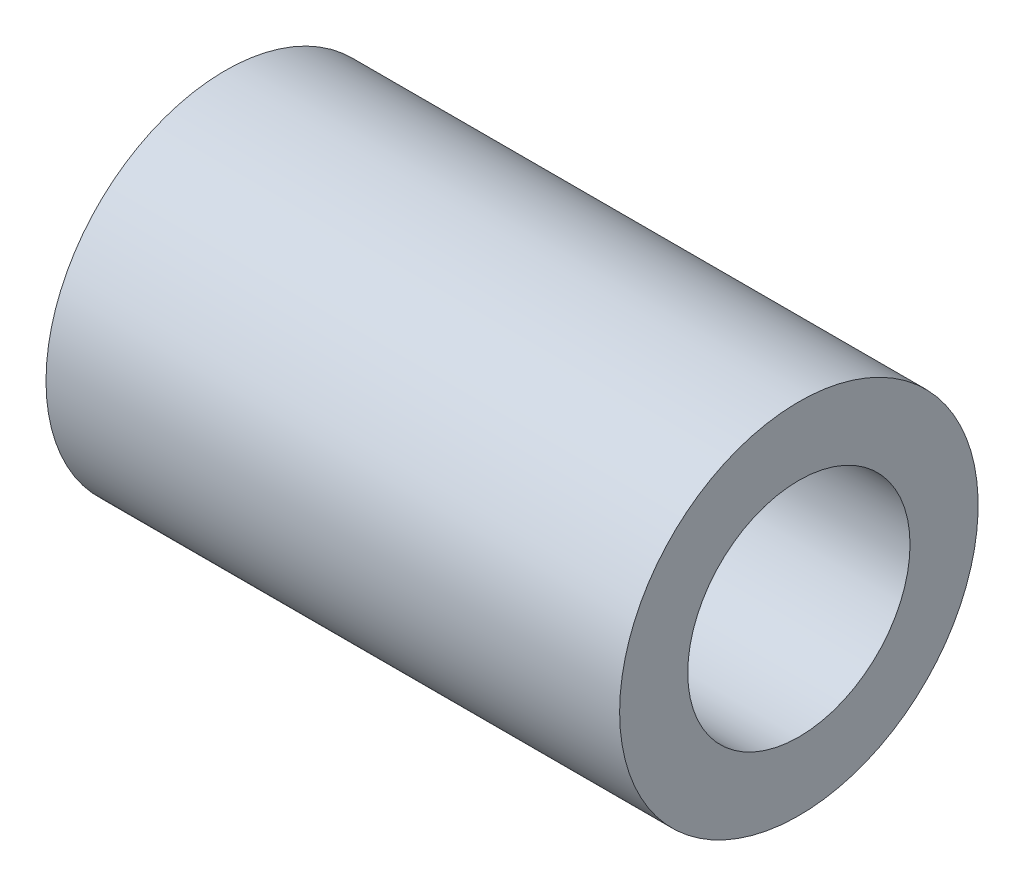
ISO-10303-21;
HEADER;
FILE_DESCRIPTION(('STEP AP214'),'2;1');
FILE_NAME('part.step','',(''),(''),'','','');
FILE_SCHEMA(('AUTOMOTIVE_DESIGN { 1 0 10303 214 1 1 1 1 }'));
ENDSEC;
DATA;
#1=APPLICATION_CONTEXT('core data for automotive mechanical design processes');
#2=APPLICATION_PROTOCOL_DEFINITION('international standard','automotive_design',2000,#1);
#3=PRODUCT_CONTEXT('',#1,'mechanical');
#4=PRODUCT('Part','Part','',(#3));
#5=PRODUCT_RELATED_PRODUCT_CATEGORY('part','',(#4));
#6=PRODUCT_DEFINITION_FORMATION('','',#4);
#7=PRODUCT_DEFINITION_CONTEXT('part definition',#1,'design');
#8=PRODUCT_DEFINITION('design','',#6,#7);
#9=PRODUCT_DEFINITION_SHAPE('','',#8);
#10=(LENGTH_UNIT() NAMED_UNIT(*) SI_UNIT(.MILLI.,.METRE.));
#11=(NAMED_UNIT(*) PLANE_ANGLE_UNIT() SI_UNIT($,.RADIAN.));
#12=(NAMED_UNIT(*) SI_UNIT($,.STERADIAN.) SOLID_ANGLE_UNIT());
#13=UNCERTAINTY_MEASURE_WITH_UNIT(LENGTH_MEASURE(1.E-05),#10,'distance_accuracy_value','');
#14=(GEOMETRIC_REPRESENTATION_CONTEXT(3) GLOBAL_UNCERTAINTY_ASSIGNED_CONTEXT((#13)) GLOBAL_UNIT_ASSIGNED_CONTEXT((#10,
#11,#12)) REPRESENTATION_CONTEXT('',''));
#15=CARTESIAN_POINT('',(0.,0.,0.));
#16=DIRECTION('',(0.,0.,1.));
#17=DIRECTION('',(1.,0.,0.));
#18=AXIS2_PLACEMENT_3D('',#15,#16,#17);
#19=CARTESIAN_POINT('',(0.,3.1,0.));
#20=DIRECTION('',(1.,0.,0.));
#21=DIRECTION('',(0.,0.,-1.));
#22=AXIS2_PLACEMENT_3D('',#19,#20,#21);
#23=PLANE('',#22);
#24=CARTESIAN_POINT('',(0.,0.,0.));
#25=DIRECTION('',(-1.,0.,0.));
#26=DIRECTION('',(0.,0.,1.));
#27=AXIS2_PLACEMENT_3D('',#24,#25,#26);
#28=CIRCLE('',#27,3.1);
#29=CARTESIAN_POINT('',(0.,0.,3.1));
#30=VERTEX_POINT('',#29);
#31=EDGE_CURVE('E46',#30,#30,#28,.T.);
#32=ORIENTED_EDGE('',*,*,#31,.F.);
#33=EDGE_LOOP('',(#32));
#34=FACE_BOUND('',#33,.T.);
#35=CARTESIAN_POINT('',(0.,0.,0.));
#36=DIRECTION('',(-1.,0.,0.));
#37=DIRECTION('',(0.,0.,1.));
#38=AXIS2_PLACEMENT_3D('',#35,#36,#37);
#39=CIRCLE('',#38,5.);
#40=CARTESIAN_POINT('',(0.,0.,5.));
#41=VERTEX_POINT('',#40);
#42=EDGE_CURVE('E10',#41,#41,#39,.T.);
#43=ORIENTED_EDGE('',*,*,#42,.T.);
#44=EDGE_LOOP('',(#43));
#45=FACE_BOUND('',#44,.T.);
#46=ADVANCED_FACE('F32',(#34,#45),#23,.F.);
#47=CARTESIAN_POINT('',(0.,0.,0.));
#48=DIRECTION('',(-1.,0.,0.));
#49=DIRECTION('',(0.,0.,1.));
#50=AXIS2_PLACEMENT_3D('',#47,#48,#49);
#51=CYLINDRICAL_SURFACE('',#50,5.);
#52=ORIENTED_EDGE('',*,*,#42,.F.);
#53=EDGE_LOOP('',(#52));
#54=FACE_BOUND('',#53,.T.);
#55=CARTESIAN_POINT('',(16.,0.,0.));
#56=DIRECTION('',(-1.,0.,0.));
#57=DIRECTION('',(0.,0.,1.));
#58=AXIS2_PLACEMENT_3D('',#55,#56,#57);
#59=CIRCLE('',#58,5.);
#60=CARTESIAN_POINT('',(16.,0.,5.));
#61=VERTEX_POINT('',#60);
#62=EDGE_CURVE('E38',#61,#61,#59,.T.);
#63=ORIENTED_EDGE('',*,*,#62,.T.);
#64=EDGE_LOOP('',(#63));
#65=FACE_BOUND('',#64,.T.);
#66=ADVANCED_FACE('F55',(#54,#65),#51,.T.);
#67=CARTESIAN_POINT('',(16.,3.1,0.));
#68=DIRECTION('',(-1.,0.,0.));
#69=DIRECTION('',(0.,0.,1.));
#70=AXIS2_PLACEMENT_3D('',#67,#68,#69);
#71=PLANE('',#70);
#72=ORIENTED_EDGE('',*,*,#62,.F.);
#73=EDGE_LOOP('',(#72));
#74=FACE_BOUND('',#73,.T.);
#75=CARTESIAN_POINT('',(16.,0.,0.));
#76=DIRECTION('',(-1.,0.,0.));
#77=DIRECTION('',(0.,0.,1.));
#78=AXIS2_PLACEMENT_3D('',#75,#76,#77);
#79=CIRCLE('',#78,3.1);
#80=CARTESIAN_POINT('',(16.,0.,3.1));
#81=VERTEX_POINT('',#80);
#82=EDGE_CURVE('E42',#81,#81,#79,.T.);
#83=ORIENTED_EDGE('',*,*,#82,.T.);
#84=EDGE_LOOP('',(#83));
#85=FACE_BOUND('',#84,.T.);
#86=ADVANCED_FACE('F59',(#74,#85),#71,.F.);
#87=CARTESIAN_POINT('',(0.,0.,0.));
#88=DIRECTION('',(-1.,0.,0.));
#89=DIRECTION('',(0.,0.,1.));
#90=AXIS2_PLACEMENT_3D('',#87,#88,#89);
#91=CYLINDRICAL_SURFACE('',#90,3.1);
#92=ORIENTED_EDGE('',*,*,#82,.F.);
#93=EDGE_LOOP('',(#92));
#94=FACE_BOUND('',#93,.T.);
#95=ORIENTED_EDGE('',*,*,#31,.T.);
#96=EDGE_LOOP('',(#95));
#97=FACE_BOUND('',#96,.T.);
#98=ADVANCED_FACE('F52',(#94,#97),#91,.F.);
#99=CLOSED_SHELL('',(#46,#66,#86,#98));
#100=MANIFOLD_SOLID_BREP('B2',#99);
#101=ADVANCED_BREP_SHAPE_REPRESENTATION('',(#18,#100),#14);
#102=SHAPE_DEFINITION_REPRESENTATION(#9,#101);
ENDSEC;
END-ISO-10303-21;
